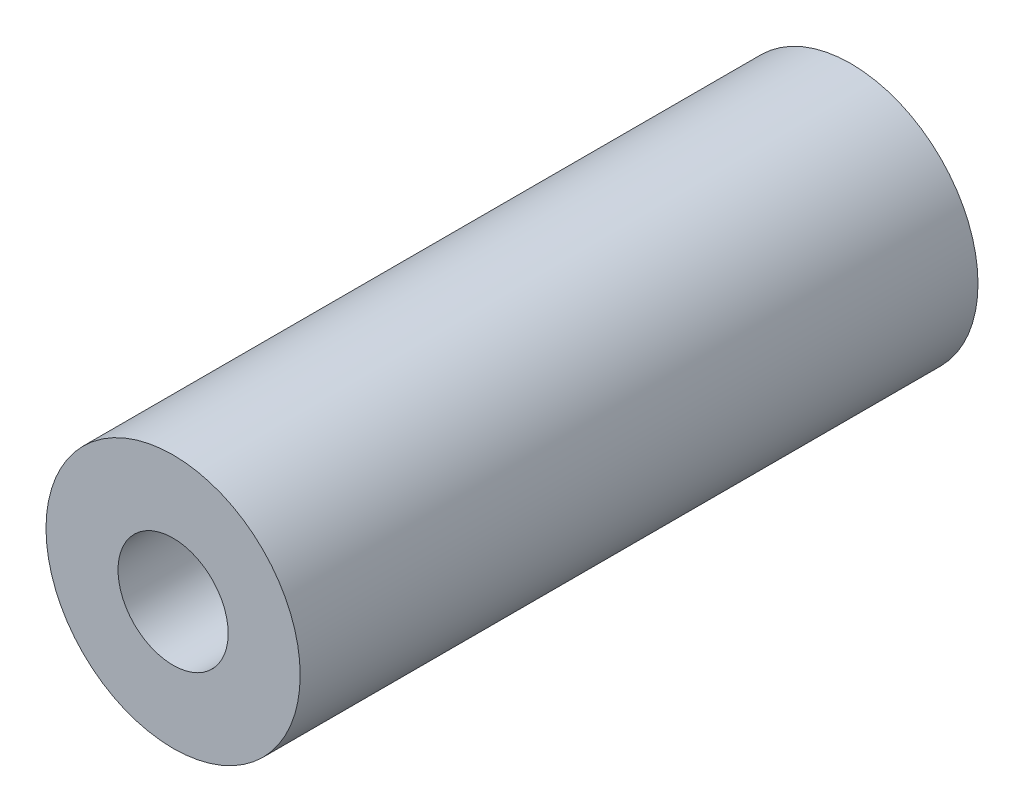
ISO-10303-21;
HEADER;
FILE_DESCRIPTION(('STEP AP214'),'2;1');
FILE_NAME('part.step','',(''),(''),'','','');
FILE_SCHEMA(('AUTOMOTIVE_DESIGN { 1 0 10303 214 1 1 1 1 }'));
ENDSEC;
DATA;
#1=APPLICATION_CONTEXT('core data for automotive mechanical design processes');
#2=APPLICATION_PROTOCOL_DEFINITION('international standard','automotive_design',2000,#1);
#3=PRODUCT_CONTEXT('',#1,'mechanical');
#4=PRODUCT('Part','Part','',(#3));
#5=PRODUCT_RELATED_PRODUCT_CATEGORY('part','',(#4));
#6=PRODUCT_DEFINITION_FORMATION('','',#4);
#7=PRODUCT_DEFINITION_CONTEXT('part definition',#1,'design');
#8=PRODUCT_DEFINITION('design','',#6,#7);
#9=PRODUCT_DEFINITION_SHAPE('','',#8);
#10=(LENGTH_UNIT() NAMED_UNIT(*) SI_UNIT(.MILLI.,.METRE.));
#11=(NAMED_UNIT(*) PLANE_ANGLE_UNIT() SI_UNIT($,.RADIAN.));
#12=(NAMED_UNIT(*) SI_UNIT($,.STERADIAN.) SOLID_ANGLE_UNIT());
#13=UNCERTAINTY_MEASURE_WITH_UNIT(LENGTH_MEASURE(1.E-05),#10,'distance_accuracy_value','');
#14=(GEOMETRIC_REPRESENTATION_CONTEXT(3) GLOBAL_UNCERTAINTY_ASSIGNED_CONTEXT((#13)) GLOBAL_UNIT_ASSIGNED_CONTEXT((#10,
#11,#12)) REPRESENTATION_CONTEXT('',''));
#15=CARTESIAN_POINT('',(0.,0.,0.));
#16=DIRECTION('',(0.,0.,1.));
#17=DIRECTION('',(1.,0.,0.));
#18=AXIS2_PLACEMENT_3D('',#15,#16,#17);
#19=CARTESIAN_POINT('',(0.,0.,-25.4));
#20=DIRECTION('',(0.,0.,1.));
#21=DIRECTION('',(1.,0.,0.));
#22=AXIS2_PLACEMENT_3D('',#19,#20,#21);
#23=CYLINDRICAL_SURFACE('',#22,9.525);
#24=CARTESIAN_POINT('',(0.,0.,-25.4));
#25=DIRECTION('',(0.,0.,1.));
#26=DIRECTION('',(1.,0.,0.));
#27=AXIS2_PLACEMENT_3D('',#24,#25,#26);
#28=CIRCLE('',#27,9.525);
#29=CARTESIAN_POINT('',(9.525,0.,-25.4));
#30=VERTEX_POINT('',#29);
#31=EDGE_CURVE('E10',#30,#30,#28,.T.);
#32=ORIENTED_EDGE('',*,*,#31,.T.);
#33=EDGE_LOOP('',(#32));
#34=FACE_BOUND('',#33,.T.);
#35=CARTESIAN_POINT('',(0.,0.,25.4));
#36=DIRECTION('',(0.,0.,1.));
#37=DIRECTION('',(1.,0.,0.));
#38=AXIS2_PLACEMENT_3D('',#35,#36,#37);
#39=CIRCLE('',#38,9.525);
#40=CARTESIAN_POINT('',(9.525,0.,25.4));
#41=VERTEX_POINT('',#40);
#42=EDGE_CURVE('E52',#41,#41,#39,.T.);
#43=ORIENTED_EDGE('',*,*,#42,.F.);
#44=EDGE_LOOP('',(#43));
#45=FACE_BOUND('',#44,.T.);
#46=ADVANCED_FACE('F39',(#34,#45),#23,.T.);
#47=CARTESIAN_POINT('',(0.,0.,-25.4));
#48=DIRECTION('',(0.,0.,1.));
#49=DIRECTION('',(1.,0.,0.));
#50=AXIS2_PLACEMENT_3D('',#47,#48,#49);
#51=PLANE('',#50);
#52=CARTESIAN_POINT('',(0.,0.,-25.4));
#53=DIRECTION('',(0.,0.,1.));
#54=DIRECTION('',(1.,0.,0.));
#55=AXIS2_PLACEMENT_3D('',#52,#53,#54);
#56=CIRCLE('',#55,4.1275);
#57=CARTESIAN_POINT('',(4.1275,0.,-25.4));
#58=VERTEX_POINT('',#57);
#59=EDGE_CURVE('E46',#58,#58,#56,.T.);
#60=ORIENTED_EDGE('',*,*,#59,.T.);
#61=EDGE_LOOP('',(#60));
#62=FACE_BOUND('',#61,.T.);
#63=ORIENTED_EDGE('',*,*,#31,.F.);
#64=EDGE_LOOP('',(#63));
#65=FACE_BOUND('',#64,.T.);
#66=ADVANCED_FACE('F75',(#62,#65),#51,.F.);
#67=CARTESIAN_POINT('',(0.,0.,-25.4));
#68=DIRECTION('',(0.,0.,1.));
#69=DIRECTION('',(1.,0.,0.));
#70=AXIS2_PLACEMENT_3D('',#67,#68,#69);
#71=CYLINDRICAL_SURFACE('',#70,4.1275);
#72=ORIENTED_EDGE('',*,*,#59,.F.);
#73=EDGE_LOOP('',(#72));
#74=FACE_BOUND('',#73,.T.);
#75=CARTESIAN_POINT('',(0.,0.,25.4));
#76=DIRECTION('',(0.,0.,1.));
#77=DIRECTION('',(1.,0.,0.));
#78=AXIS2_PLACEMENT_3D('',#75,#76,#77);
#79=CIRCLE('',#78,4.1275);
#80=CARTESIAN_POINT('',(4.1275,0.,25.4));
#81=VERTEX_POINT('',#80);
#82=EDGE_CURVE('E58',#81,#81,#79,.T.);
#83=ORIENTED_EDGE('',*,*,#82,.T.);
#84=EDGE_LOOP('',(#83));
#85=FACE_BOUND('',#84,.T.);
#86=ADVANCED_FACE('F66',(#74,#85),#71,.F.);
#87=CARTESIAN_POINT('',(0.,0.,25.4));
#88=DIRECTION('',(0.,0.,1.));
#89=DIRECTION('',(1.,0.,0.));
#90=AXIS2_PLACEMENT_3D('',#87,#88,#89);
#91=PLANE('',#90);
#92=ORIENTED_EDGE('',*,*,#42,.T.);
#93=EDGE_LOOP('',(#92));
#94=FACE_BOUND('',#93,.T.);
#95=ORIENTED_EDGE('',*,*,#82,.F.);
#96=EDGE_LOOP('',(#95));
#97=FACE_BOUND('',#96,.T.);
#98=ADVANCED_FACE('F68',(#94,#97),#91,.T.);
#99=CLOSED_SHELL('',(#46,#66,#86,#98));
#100=MANIFOLD_SOLID_BREP('B2',#99);
#101=ADVANCED_BREP_SHAPE_REPRESENTATION('',(#18,#100),#14);
#102=SHAPE_DEFINITION_REPRESENTATION(#9,#101);
ENDSEC;
END-ISO-10303-21;
